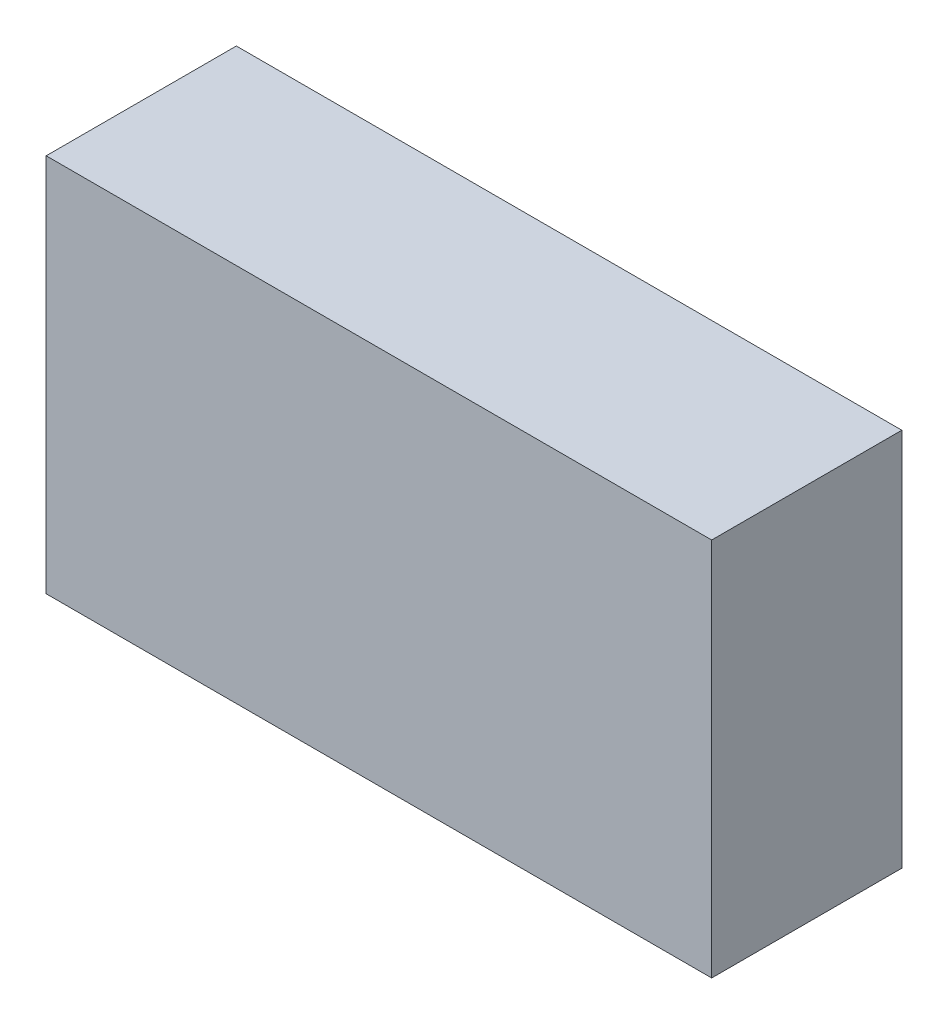
ISO-10303-21;
HEADER;
FILE_DESCRIPTION(('STEP AP214'),'2;1');
FILE_NAME('part.step','',(''),(''),'','','');
FILE_SCHEMA(('AUTOMOTIVE_DESIGN { 1 0 10303 214 1 1 1 1 }'));
ENDSEC;
DATA;
#1=APPLICATION_CONTEXT('core data for automotive mechanical design processes');
#2=APPLICATION_PROTOCOL_DEFINITION('international standard','automotive_design',2000,#1);
#3=PRODUCT_CONTEXT('',#1,'mechanical');
#4=PRODUCT('Part','Part','',(#3));
#5=PRODUCT_RELATED_PRODUCT_CATEGORY('part','',(#4));
#6=PRODUCT_DEFINITION_FORMATION('','',#4);
#7=PRODUCT_DEFINITION_CONTEXT('part definition',#1,'design');
#8=PRODUCT_DEFINITION('design','',#6,#7);
#9=PRODUCT_DEFINITION_SHAPE('','',#8);
#10=(LENGTH_UNIT() NAMED_UNIT(*) SI_UNIT(.MILLI.,.METRE.));
#11=(NAMED_UNIT(*) PLANE_ANGLE_UNIT() SI_UNIT($,.RADIAN.));
#12=(NAMED_UNIT(*) SI_UNIT($,.STERADIAN.) SOLID_ANGLE_UNIT());
#13=UNCERTAINTY_MEASURE_WITH_UNIT(LENGTH_MEASURE(1.E-05),#10,'distance_accuracy_value','');
#14=(GEOMETRIC_REPRESENTATION_CONTEXT(3) GLOBAL_UNCERTAINTY_ASSIGNED_CONTEXT((#13)) GLOBAL_UNIT_ASSIGNED_CONTEXT((#10,
#11,#12)) REPRESENTATION_CONTEXT('',''));
#15=CARTESIAN_POINT('',(0.,0.,0.));
#16=DIRECTION('',(0.,0.,1.));
#17=DIRECTION('',(1.,0.,0.));
#18=AXIS2_PLACEMENT_3D('',#15,#16,#17);
#19=CARTESIAN_POINT('',(-1.75,1.,1.));
#20=DIRECTION('',(0.,0.,1.));
#21=DIRECTION('',(1.,0.,0.));
#22=AXIS2_PLACEMENT_3D('',#19,#20,#21);
#23=PLANE('',#22);
#24=DIRECTION('',(0.,1.,0.));
#25=VECTOR('',#24,1.);
#26=CARTESIAN_POINT('',(1.75,1.,1.));
#27=LINE('',#26,#25);
#28=CARTESIAN_POINT('',(1.75,1.,1.));
#29=VERTEX_POINT('',#28);
#30=CARTESIAN_POINT('',(1.75,-0.995,1.));
#31=VERTEX_POINT('',#30);
#32=EDGE_CURVE('E53',#29,#31,#27,.F.);
#33=ORIENTED_EDGE('',*,*,#32,.F.);
#34=DIRECTION('',(1.,0.,0.));
#35=VECTOR('',#34,1.);
#36=CARTESIAN_POINT('',(-1.75,1.,1.));
#37=LINE('',#36,#35);
#38=CARTESIAN_POINT('',(-1.75,1.,1.));
#39=VERTEX_POINT('',#38);
#40=EDGE_CURVE('E68',#39,#29,#37,.T.);
#41=ORIENTED_EDGE('',*,*,#40,.F.);
#42=DIRECTION('',(0.,1.,0.));
#43=VECTOR('',#42,1.);
#44=CARTESIAN_POINT('',(-1.75,-0.995,1.));
#45=LINE('',#44,#43);
#46=CARTESIAN_POINT('',(-1.75,-0.995,1.));
#47=VERTEX_POINT('',#46);
#48=EDGE_CURVE('E20',#47,#39,#45,.T.);
#49=ORIENTED_EDGE('',*,*,#48,.F.);
#50=DIRECTION('',(1.,0.,0.));
#51=VECTOR('',#50,1.);
#52=CARTESIAN_POINT('',(1.75,-0.995,1.));
#53=LINE('',#52,#51);
#54=EDGE_CURVE('E58',#31,#47,#53,.F.);
#55=ORIENTED_EDGE('',*,*,#54,.F.);
#56=EDGE_LOOP('',(#33,#41,#49,#55));
#57=FACE_BOUND('',#56,.T.);
#58=ADVANCED_FACE('F17',(#57),#23,.T.);
#59=CARTESIAN_POINT('',(-1.75,-0.995,0.));
#60=DIRECTION('',(-1.,0.,0.));
#61=DIRECTION('',(0.,0.,1.));
#62=AXIS2_PLACEMENT_3D('',#59,#60,#61);
#63=PLANE('',#62);
#64=DIRECTION('',(0.,0.,1.));
#65=VECTOR('',#64,1.);
#66=CARTESIAN_POINT('',(-1.75,1.,0.));
#67=LINE('',#66,#65);
#68=CARTESIAN_POINT('',(-1.75,1.,0.));
#69=VERTEX_POINT('',#68);
#70=EDGE_CURVE('E79',#69,#39,#67,.T.);
#71=ORIENTED_EDGE('',*,*,#70,.F.);
#72=DIRECTION('',(0.,1.,0.));
#73=VECTOR('',#72,1.);
#74=CARTESIAN_POINT('',(-1.75,1.,0.));
#75=LINE('',#74,#73);
#76=CARTESIAN_POINT('',(-1.75,-0.995,0.));
#77=VERTEX_POINT('',#76);
#78=EDGE_CURVE('E74',#69,#77,#75,.F.);
#79=ORIENTED_EDGE('',*,*,#78,.T.);
#80=DIRECTION('',(0.,0.,-1.));
#81=VECTOR('',#80,1.);
#82=CARTESIAN_POINT('',(-1.75,-0.995,0.));
#83=LINE('',#82,#81);
#84=EDGE_CURVE('E63',#47,#77,#83,.T.);
#85=ORIENTED_EDGE('',*,*,#84,.F.);
#86=ORIENTED_EDGE('',*,*,#48,.T.);
#87=EDGE_LOOP('',(#71,#79,#85,#86));
#88=FACE_BOUND('',#87,.T.);
#89=ADVANCED_FACE('F73',(#88),#63,.T.);
#90=CARTESIAN_POINT('',(1.75,-0.995,0.));
#91=DIRECTION('',(0.,-1.,0.));
#92=DIRECTION('',(0.,0.,-1.));
#93=AXIS2_PLACEMENT_3D('',#90,#91,#92);
#94=PLANE('',#93);
#95=ORIENTED_EDGE('',*,*,#84,.T.);
#96=DIRECTION('',(1.,0.,0.));
#97=VECTOR('',#96,1.);
#98=CARTESIAN_POINT('',(-1.75,-0.995,0.));
#99=LINE('',#98,#97);
#100=CARTESIAN_POINT('',(1.75,-0.995,0.));
#101=VERTEX_POINT('',#100);
#102=EDGE_CURVE('E84',#77,#101,#99,.T.);
#103=ORIENTED_EDGE('',*,*,#102,.T.);
#104=DIRECTION('',(0.,0.,-1.));
#105=VECTOR('',#104,1.);
#106=CARTESIAN_POINT('',(1.75,-0.995,0.));
#107=LINE('',#106,#105);
#108=EDGE_CURVE('E65',#31,#101,#107,.T.);
#109=ORIENTED_EDGE('',*,*,#108,.F.);
#110=ORIENTED_EDGE('',*,*,#54,.T.);
#111=EDGE_LOOP('',(#95,#103,#109,#110));
#112=FACE_BOUND('',#111,.T.);
#113=ADVANCED_FACE('F60',(#112),#94,.T.);
#114=CARTESIAN_POINT('',(1.75,1.,0.));
#115=DIRECTION('',(1.,0.,0.));
#116=DIRECTION('',(0.,0.,-1.));
#117=AXIS2_PLACEMENT_3D('',#114,#115,#116);
#118=PLANE('',#117);
#119=ORIENTED_EDGE('',*,*,#108,.T.);
#120=DIRECTION('',(0.,1.,0.));
#121=VECTOR('',#120,1.);
#122=CARTESIAN_POINT('',(1.75,1.,0.));
#123=LINE('',#122,#121);
#124=CARTESIAN_POINT('',(1.75,1.,0.));
#125=VERTEX_POINT('',#124);
#126=EDGE_CURVE('E26',#101,#125,#123,.T.);
#127=ORIENTED_EDGE('',*,*,#126,.T.);
#128=DIRECTION('',(0.,0.,1.));
#129=VECTOR('',#128,1.);
#130=CARTESIAN_POINT('',(1.75,1.,0.));
#131=LINE('',#130,#129);
#132=EDGE_CURVE('E34',#29,#125,#131,.F.);
#133=ORIENTED_EDGE('',*,*,#132,.F.);
#134=ORIENTED_EDGE('',*,*,#32,.T.);
#135=EDGE_LOOP('',(#119,#127,#133,#134));
#136=FACE_BOUND('',#135,.T.);
#137=ADVANCED_FACE('F88',(#136),#118,.T.);
#138=CARTESIAN_POINT('',(-1.75,1.,0.));
#139=DIRECTION('',(0.,1.,0.));
#140=DIRECTION('',(0.,0.,1.));
#141=AXIS2_PLACEMENT_3D('',#138,#139,#140);
#142=PLANE('',#141);
#143=ORIENTED_EDGE('',*,*,#132,.T.);
#144=DIRECTION('',(1.,0.,0.));
#145=VECTOR('',#144,1.);
#146=CARTESIAN_POINT('',(-1.75,1.,0.));
#147=LINE('',#146,#145);
#148=EDGE_CURVE('E11',#125,#69,#147,.F.);
#149=ORIENTED_EDGE('',*,*,#148,.T.);
#150=ORIENTED_EDGE('',*,*,#70,.T.);
#151=ORIENTED_EDGE('',*,*,#40,.T.);
#152=EDGE_LOOP('',(#143,#149,#150,#151));
#153=FACE_BOUND('',#152,.T.);
#154=ADVANCED_FACE('F91',(#153),#142,.T.);
#155=CARTESIAN_POINT('',(-1.75,1.,0.));
#156=DIRECTION('',(0.,0.,1.));
#157=DIRECTION('',(1.,0.,0.));
#158=AXIS2_PLACEMENT_3D('',#155,#156,#157);
#159=PLANE('',#158);
#160=ORIENTED_EDGE('',*,*,#126,.F.);
#161=ORIENTED_EDGE('',*,*,#102,.F.);
#162=ORIENTED_EDGE('',*,*,#78,.F.);
#163=ORIENTED_EDGE('',*,*,#148,.F.);
#164=EDGE_LOOP('',(#160,#161,#162,#163));
#165=FACE_BOUND('',#164,.T.);
#166=ADVANCED_FACE('F90',(#165),#159,.F.);
#167=CLOSED_SHELL('',(#58,#89,#113,#137,#154,#166));
#168=MANIFOLD_SOLID_BREP('B1',#167);
#169=ADVANCED_BREP_SHAPE_REPRESENTATION('',(#18,#168),#14);
#170=SHAPE_DEFINITION_REPRESENTATION(#9,#169);
ENDSEC;
END-ISO-10303-21;
